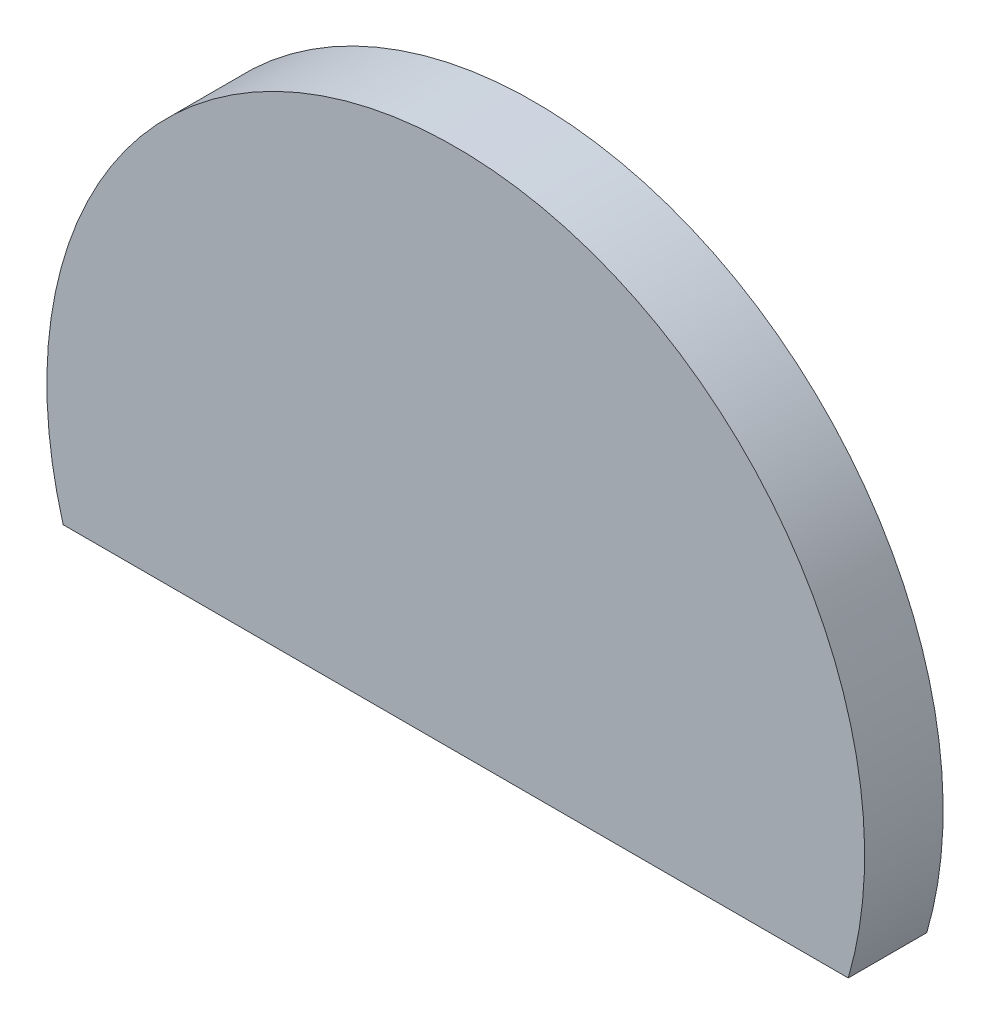
ISO-10303-21;
HEADER;
FILE_DESCRIPTION(('STEP AP214'),'2;1');
FILE_NAME('part.step','',(''),(''),'','','');
FILE_SCHEMA(('AUTOMOTIVE_DESIGN { 1 0 10303 214 1 1 1 1 }'));
ENDSEC;
DATA;
#1=APPLICATION_CONTEXT('core data for automotive mechanical design processes');
#2=APPLICATION_PROTOCOL_DEFINITION('international standard','automotive_design',2000,#1);
#3=PRODUCT_CONTEXT('',#1,'mechanical');
#4=PRODUCT('Part','Part','',(#3));
#5=PRODUCT_RELATED_PRODUCT_CATEGORY('part','',(#4));
#6=PRODUCT_DEFINITION_FORMATION('','',#4);
#7=PRODUCT_DEFINITION_CONTEXT('part definition',#1,'design');
#8=PRODUCT_DEFINITION('design','',#6,#7);
#9=PRODUCT_DEFINITION_SHAPE('','',#8);
#10=(LENGTH_UNIT() NAMED_UNIT(*) SI_UNIT(.MILLI.,.METRE.));
#11=(NAMED_UNIT(*) PLANE_ANGLE_UNIT() SI_UNIT($,.RADIAN.));
#12=(NAMED_UNIT(*) SI_UNIT($,.STERADIAN.) SOLID_ANGLE_UNIT());
#13=UNCERTAINTY_MEASURE_WITH_UNIT(LENGTH_MEASURE(1.E-05),#10,'distance_accuracy_value','');
#14=(GEOMETRIC_REPRESENTATION_CONTEXT(3) GLOBAL_UNCERTAINTY_ASSIGNED_CONTEXT((#13)) GLOBAL_UNIT_ASSIGNED_CONTEXT((#10,
#11,#12)) REPRESENTATION_CONTEXT('',''));
#15=CARTESIAN_POINT('',(0.,0.,0.));
#16=DIRECTION('',(0.,0.,1.));
#17=DIRECTION('',(1.,0.,0.));
#18=AXIS2_PLACEMENT_3D('',#15,#16,#17);
#19=CARTESIAN_POINT('',(0.,184.375,3.));
#20=DIRECTION('',(0.,0.,-1.));
#21=DIRECTION('',(-1.,0.,0.));
#22=AXIS2_PLACEMENT_3D('',#19,#20,#21);
#23=CYLINDRICAL_SURFACE('',#22,15.625);
#24=CARTESIAN_POINT('',(0.,184.375,0.));
#25=DIRECTION('',(0.,0.,1.));
#26=DIRECTION('',(-1.,0.,0.));
#27=AXIS2_PLACEMENT_3D('',#24,#25,#26);
#28=CIRCLE('',#27,15.625);
#29=CARTESIAN_POINT('',(15.,180.,0.));
#30=VERTEX_POINT('',#29);
#31=CARTESIAN_POINT('',(-15.,180.,0.));
#32=VERTEX_POINT('',#31);
#33=EDGE_CURVE('E69',#30,#32,#28,.T.);
#34=ORIENTED_EDGE('',*,*,#33,.T.);
#35=DIRECTION('',(0.,0.,-1.));
#36=VECTOR('',#35,1.);
#37=CARTESIAN_POINT('',(-15.,180.,3.));
#38=LINE('',#37,#36);
#39=CARTESIAN_POINT('',(-15.,180.,3.));
#40=VERTEX_POINT('',#39);
#41=EDGE_CURVE('E66',#40,#32,#38,.T.);
#42=ORIENTED_EDGE('',*,*,#41,.F.);
#43=CARTESIAN_POINT('',(0.,184.375,3.));
#44=DIRECTION('',(0.,0.,1.));
#45=DIRECTION('',(-1.,0.,0.));
#46=AXIS2_PLACEMENT_3D('',#43,#44,#45);
#47=CIRCLE('',#46,15.625);
#48=CARTESIAN_POINT('',(15.,180.,3.));
#49=VERTEX_POINT('',#48);
#50=EDGE_CURVE('E57',#49,#40,#47,.T.);
#51=ORIENTED_EDGE('',*,*,#50,.F.);
#52=DIRECTION('',(0.,0.,-1.));
#53=VECTOR('',#52,1.);
#54=CARTESIAN_POINT('',(15.,180.,3.));
#55=LINE('',#54,#53);
#56=EDGE_CURVE('E11',#49,#30,#55,.T.);
#57=ORIENTED_EDGE('',*,*,#56,.T.);
#58=EDGE_LOOP('',(#34,#42,#51,#57));
#59=FACE_BOUND('',#58,.T.);
#60=ADVANCED_FACE('F36',(#59),#23,.T.);
#61=CARTESIAN_POINT('',(15.,180.,3.));
#62=DIRECTION('',(0.,1.,0.));
#63=DIRECTION('',(0.,0.,1.));
#64=AXIS2_PLACEMENT_3D('',#61,#62,#63);
#65=PLANE('',#64);
#66=DIRECTION('',(1.,0.,0.));
#67=VECTOR('',#66,1.);
#68=CARTESIAN_POINT('',(15.,180.,0.));
#69=LINE('',#68,#67);
#70=EDGE_CURVE('E61',#32,#30,#69,.T.);
#71=ORIENTED_EDGE('',*,*,#70,.T.);
#72=ORIENTED_EDGE('',*,*,#56,.F.);
#73=DIRECTION('',(1.,0.,0.));
#74=VECTOR('',#73,1.);
#75=CARTESIAN_POINT('',(15.,180.,3.));
#76=LINE('',#75,#74);
#77=EDGE_CURVE('E44',#40,#49,#76,.T.);
#78=ORIENTED_EDGE('',*,*,#77,.F.);
#79=ORIENTED_EDGE('',*,*,#41,.T.);
#80=EDGE_LOOP('',(#71,#72,#78,#79));
#81=FACE_BOUND('',#80,.T.);
#82=ADVANCED_FACE('F65',(#81),#65,.F.);
#83=CARTESIAN_POINT('',(0.,184.375,3.));
#84=DIRECTION('',(0.,0.,-1.));
#85=DIRECTION('',(-1.,0.,0.));
#86=AXIS2_PLACEMENT_3D('',#83,#84,#85);
#87=PLANE('',#86);
#88=ORIENTED_EDGE('',*,*,#50,.T.);
#89=ORIENTED_EDGE('',*,*,#77,.T.);
#90=EDGE_LOOP('',(#88,#89));
#91=FACE_BOUND('',#90,.T.);
#92=ADVANCED_FACE('F58',(#91),#87,.F.);
#93=CARTESIAN_POINT('',(0.,184.375,0.));
#94=DIRECTION('',(0.,0.,-1.));
#95=DIRECTION('',(-1.,0.,0.));
#96=AXIS2_PLACEMENT_3D('',#93,#94,#95);
#97=PLANE('',#96);
#98=ORIENTED_EDGE('',*,*,#33,.F.);
#99=ORIENTED_EDGE('',*,*,#70,.F.);
#100=EDGE_LOOP('',(#98,#99));
#101=FACE_BOUND('',#100,.T.);
#102=ADVANCED_FACE('F74',(#101),#97,.T.);
#103=CLOSED_SHELL('',(#60,#82,#92,#102));
#104=MANIFOLD_SOLID_BREP('B2',#103);
#105=ADVANCED_BREP_SHAPE_REPRESENTATION('',(#18,#104),#14);
#106=SHAPE_DEFINITION_REPRESENTATION(#9,#105);
ENDSEC;
END-ISO-10303-21;
